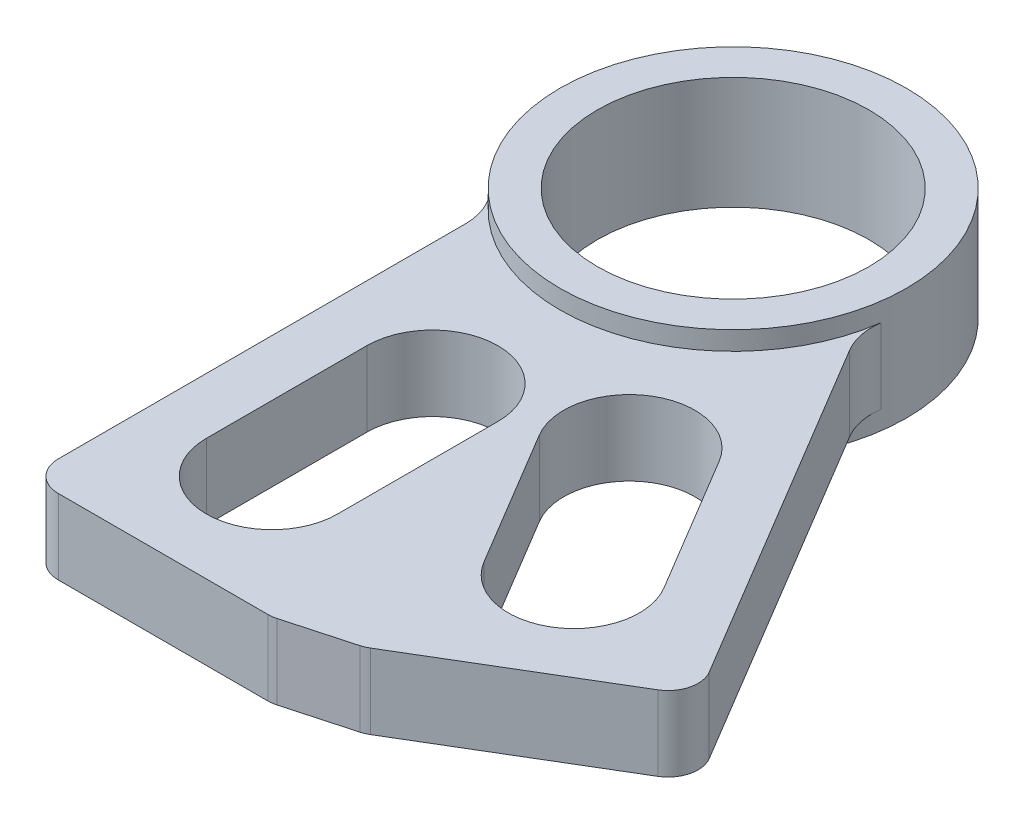
ISO-10303-21;
HEADER;
FILE_DESCRIPTION(('STEP AP214'),'2;1');
FILE_NAME('part.step','',(''),(''),'','','');
FILE_SCHEMA(('AUTOMOTIVE_DESIGN { 1 0 10303 214 1 1 1 1 }'));
ENDSEC;
DATA;
#1=APPLICATION_CONTEXT('core data for automotive mechanical design processes');
#2=APPLICATION_PROTOCOL_DEFINITION('international standard','automotive_design',2000,#1);
#3=PRODUCT_CONTEXT('',#1,'mechanical');
#4=PRODUCT('Part','Part','',(#3));
#5=PRODUCT_RELATED_PRODUCT_CATEGORY('part','',(#4));
#6=PRODUCT_DEFINITION_FORMATION('','',#4);
#7=PRODUCT_DEFINITION_CONTEXT('part definition',#1,'design');
#8=PRODUCT_DEFINITION('design','',#6,#7);
#9=PRODUCT_DEFINITION_SHAPE('','',#8);
#10=(LENGTH_UNIT() NAMED_UNIT(*) SI_UNIT(.MILLI.,.METRE.));
#11=(NAMED_UNIT(*) PLANE_ANGLE_UNIT() SI_UNIT($,.RADIAN.));
#12=(NAMED_UNIT(*) SI_UNIT($,.STERADIAN.) SOLID_ANGLE_UNIT());
#13=UNCERTAINTY_MEASURE_WITH_UNIT(LENGTH_MEASURE(1.E-05),#10,'distance_accuracy_value','');
#14=(GEOMETRIC_REPRESENTATION_CONTEXT(3) GLOBAL_UNCERTAINTY_ASSIGNED_CONTEXT((#13)) GLOBAL_UNIT_ASSIGNED_CONTEXT((#10,
#11,#12)) REPRESENTATION_CONTEXT('',''));
#15=CARTESIAN_POINT('',(0.,0.,0.));
#16=DIRECTION('',(0.,0.,1.));
#17=DIRECTION('',(1.,0.,0.));
#18=AXIS2_PLACEMENT_3D('',#15,#16,#17);
#19=CARTESIAN_POINT('',(0.,4.7625,0.));
#20=DIRECTION('',(0.,-1.,0.));
#21=DIRECTION('',(0.,0.,-1.));
#22=AXIS2_PLACEMENT_3D('',#19,#20,#21);
#23=CYLINDRICAL_SURFACE('',#22,11.5062);
#24=CARTESIAN_POINT('',(0.,4.7625,0.));
#25=DIRECTION('',(0.,1.,0.));
#26=DIRECTION('',(0.,0.,1.));
#27=AXIS2_PLACEMENT_3D('',#24,#25,#26);
#28=CIRCLE('',#27,11.5062);
#29=CARTESIAN_POINT('',(0.,4.7625,-11.5062));
#30=VERTEX_POINT('',#29);
#31=EDGE_CURVE('E285',#30,#30,#28,.T.);
#32=CARTESIAN_POINT('',(0.,-4.7625,0.));
#33=DIRECTION('',(0.,1.,0.));
#34=DIRECTION('',(0.,0.,1.));
#35=AXIS2_PLACEMENT_3D('',#32,#33,#34);
#36=CIRCLE('',#35,11.5062);
#37=CARTESIAN_POINT('',(0.,-4.7625,-11.5062));
#38=VERTEX_POINT('',#37);
#39=EDGE_CURVE('E280',#38,#38,#36,.T.);
#40=CARTESIAN_POINT('',(0.,4.7625,-11.5062));
#41=CARTESIAN_POINT('',(0.,4.66328125,-11.5062));
#42=CARTESIAN_POINT('',(0.,4.5640625,-11.5062));
#43=CARTESIAN_POINT('',(0.,4.365625,-11.5062));
#44=CARTESIAN_POINT('',(0.,4.26640625,-11.5062));
#45=CARTESIAN_POINT('',(0.,4.06796875,-11.5062));
#46=CARTESIAN_POINT('',(0.,3.96875,-11.5062));
#47=CARTESIAN_POINT('',(0.,3.7703125,-11.5062));
#48=CARTESIAN_POINT('',(0.,3.67109375,-11.5062));
#49=CARTESIAN_POINT('',(0.,3.47265625,-11.5062));
#50=CARTESIAN_POINT('',(0.,3.3734375,-11.5062));
#51=CARTESIAN_POINT('',(0.,3.175,-11.5062));
#52=CARTESIAN_POINT('',(0.,3.07578125,-11.5062));
#53=CARTESIAN_POINT('',(0.,2.87734375,-11.5062));
#54=CARTESIAN_POINT('',(0.,2.778125,-11.5062));
#55=CARTESIAN_POINT('',(0.,2.5796875,-11.5062));
#56=CARTESIAN_POINT('',(0.,2.48046875,-11.5062));
#57=CARTESIAN_POINT('',(0.,2.28203125,-11.5062));
#58=CARTESIAN_POINT('',(0.,2.1828125,-11.5062));
#59=CARTESIAN_POINT('',(0.,1.984375,-11.5062));
#60=CARTESIAN_POINT('',(0.,1.88515625,-11.5062));
#61=CARTESIAN_POINT('',(0.,1.68671875,-11.5062));
#62=CARTESIAN_POINT('',(0.,1.5875,-11.5062));
#63=CARTESIAN_POINT('',(0.,1.3890625,-11.5062));
#64=CARTESIAN_POINT('',(0.,1.28984375,-11.5062));
#65=CARTESIAN_POINT('',(0.,1.09140625,-11.5062));
#66=CARTESIAN_POINT('',(0.,0.992187499999999,-11.5062));
#67=CARTESIAN_POINT('',(0.,0.79375,-11.5062));
#68=CARTESIAN_POINT('',(0.,0.69453125,-11.5062));
#69=CARTESIAN_POINT('',(0.,0.49609375,-11.5062));
#70=CARTESIAN_POINT('',(0.,0.396875,-11.5062));
#71=CARTESIAN_POINT('',(0.,0.1984375,-11.5062));
#72=CARTESIAN_POINT('',(0.,0.0992187500000001,-11.5062));
#73=CARTESIAN_POINT('',(0.,-0.0992187500000001,-11.5062));
#74=CARTESIAN_POINT('',(0.,-0.1984375,-11.5062));
#75=CARTESIAN_POINT('',(0.,-0.396875,-11.5062));
#76=CARTESIAN_POINT('',(0.,-0.49609375,-11.5062));
#77=CARTESIAN_POINT('',(0.,-0.69453125,-11.5062));
#78=CARTESIAN_POINT('',(0.,-0.793750000000001,-11.5062));
#79=CARTESIAN_POINT('',(0.,-0.992187500000001,-11.5062));
#80=CARTESIAN_POINT('',(0.,-1.09140625,-11.5062));
#81=CARTESIAN_POINT('',(0.,-1.28984375,-11.5062));
#82=CARTESIAN_POINT('',(0.,-1.3890625,-11.5062));
#83=CARTESIAN_POINT('',(0.,-1.5875,-11.5062));
#84=CARTESIAN_POINT('',(0.,-1.68671875,-11.5062));
#85=CARTESIAN_POINT('',(0.,-1.88515625,-11.5062));
#86=CARTESIAN_POINT('',(0.,-1.984375,-11.5062));
#87=CARTESIAN_POINT('',(0.,-2.1828125,-11.5062));
#88=CARTESIAN_POINT('',(0.,-2.28203125,-11.5062));
#89=CARTESIAN_POINT('',(0.,-2.48046875,-11.5062));
#90=CARTESIAN_POINT('',(0.,-2.5796875,-11.5062));
#91=CARTESIAN_POINT('',(0.,-2.778125,-11.5062));
#92=CARTESIAN_POINT('',(0.,-2.87734375,-11.5062));
#93=CARTESIAN_POINT('',(0.,-3.07578125,-11.5062));
#94=CARTESIAN_POINT('',(0.,-3.175,-11.5062));
#95=CARTESIAN_POINT('',(0.,-3.3734375,-11.5062));
#96=CARTESIAN_POINT('',(0.,-3.47265625,-11.5062));
#97=CARTESIAN_POINT('',(0.,-3.67109375,-11.5062));
#98=CARTESIAN_POINT('',(0.,-3.7703125,-11.5062));
#99=CARTESIAN_POINT('',(0.,-3.96875,-11.5062));
#100=CARTESIAN_POINT('',(0.,-4.06796875,-11.5062));
#101=CARTESIAN_POINT('',(0.,-4.26640625,-11.5062));
#102=CARTESIAN_POINT('',(0.,-4.365625,-11.5062));
#103=CARTESIAN_POINT('',(0.,-4.5640625,-11.5062));
#104=CARTESIAN_POINT('',(0.,-4.66328125,-11.5062));
#105=CARTESIAN_POINT('',(0.,-4.7625,-11.5062));
#106=B_SPLINE_CURVE_WITH_KNOTS('',3,(#40,#41,#42,#43,#44,#45,#46,#47,#48,#49,#50,#51,#52,#53,
#54,#55,#56,#57,#58,#59,#60,#61,#62,#63,#64,#65,#66,#67,#68,#69,#70,#71,#72,#73,#74,#75,#76,#77,
#78,#79,#80,#81,#82,#83,#84,#85,#86,#87,#88,#89,#90,#91,#92,#93,#94,#95,#96,#97,#98,#99,#100,
#101,#102,#103,#104,#105),.UNSPECIFIED.,.F.,.F.,(4,2,2,2,2,2,2,2,2,2,2,2,2,2,2,2,2,2,2,2,2,2,2,
2,2,2,2,2,2,2,2,2,4),(0.,0.29765625,0.5953125,0.892968750000001,1.190625,1.48828125,1.7859375,
2.08359375,2.38125,2.67890625,2.9765625,3.27421875,3.571875,3.86953125,4.1671875,4.46484375,
4.7625,5.06015625,5.3578125,5.65546875,5.953125,6.25078125,6.5484375,6.84609375,7.14375,
7.44140625,7.7390625,8.03671875,8.334375,8.63203125,8.9296875,9.22734375,9.525),.UNSPECIFIED.);
#107=EDGE_CURVE('BSEAM43',#30,#38,#106,.T.);
#108=ORIENTED_EDGE('',*,*,#31,.T.);
#109=ORIENTED_EDGE('',*,*,#39,.F.);
#110=ORIENTED_EDGE('',*,*,#107,.T.);
#111=ORIENTED_EDGE('',*,*,#107,.F.);
#112=EDGE_LOOP('',(#108,#110,#109,#111));
#113=FACE_BOUND('',#112,.T.);
#114=ADVANCED_FACE('F43',(#113),#23,.F.);
#115=CARTESIAN_POINT('',(0.,4.7625,0.));
#116=DIRECTION('',(0.,-1.,0.));
#117=DIRECTION('',(0.,0.,-1.));
#118=AXIS2_PLACEMENT_3D('',#115,#116,#117);
#119=CYLINDRICAL_SURFACE('',#118,14.6812);
#120=DIRECTION('',(0.,-1.,0.));
#121=VECTOR('',#120,1.);
#122=CARTESIAN_POINT('',(14.5403700023967,4.7625,2.02861372207778));
#123=LINE('',#122,#121);
#124=CARTESIAN_POINT('',(14.5403700023967,3.175,2.02861372207778));
#125=VERTEX_POINT('',#124);
#126=CARTESIAN_POINT('',(14.5403700023967,-3.175,2.02861372207778));
#127=VERTEX_POINT('',#126);
#128=EDGE_CURVE('E299',#125,#127,#123,.T.);
#129=ORIENTED_EDGE('',*,*,#128,.T.);
#130=CARTESIAN_POINT('',(0.,-3.175,0.));
#131=DIRECTION('',(0.,1.,0.));
#132=DIRECTION('',(0.,0.,1.));
#133=AXIS2_PLACEMENT_3D('',#130,#131,#132);
#134=CIRCLE('',#133,14.6812);
#135=CARTESIAN_POINT('',(-11.4402024421594,-3.175,9.20105437014751));
#136=VERTEX_POINT('',#135);
#137=EDGE_CURVE('E260',#136,#127,#134,.T.);
#138=ORIENTED_EDGE('',*,*,#137,.F.);
#139=DIRECTION('',(0.,-1.,0.));
#140=VECTOR('',#139,1.);
#141=CARTESIAN_POINT('',(-11.4402024421594,4.7625,9.20105437014751));
#142=LINE('',#141,#140);
#143=CARTESIAN_POINT('',(-11.4402024421594,3.175,9.20105437014751));
#144=VERTEX_POINT('',#143);
#145=EDGE_CURVE('E292',#136,#144,#142,.F.);
#146=ORIENTED_EDGE('',*,*,#145,.T.);
#147=CARTESIAN_POINT('',(0.,3.175,0.));
#148=DIRECTION('',(0.,1.,0.));
#149=DIRECTION('',(0.,0.,1.));
#150=AXIS2_PLACEMENT_3D('',#147,#148,#149);
#151=CIRCLE('',#150,14.6812);
#152=EDGE_CURVE('E224',#144,#125,#151,.T.);
#153=ORIENTED_EDGE('',*,*,#152,.T.);
#154=EDGE_LOOP('',(#129,#138,#146,#153));
#155=FACE_BOUND('',#154,.T.);
#156=CARTESIAN_POINT('',(0.,4.7625,0.));
#157=DIRECTION('',(0.,1.,0.));
#158=DIRECTION('',(0.,0.,1.));
#159=AXIS2_PLACEMENT_3D('',#156,#157,#158);
#160=CIRCLE('',#159,14.6812);
#161=CARTESIAN_POINT('',(0.,4.7625,14.6812));
#162=VERTEX_POINT('',#161);
#163=EDGE_CURVE('E288',#162,#162,#160,.T.);
#164=ORIENTED_EDGE('',*,*,#163,.F.);
#165=EDGE_LOOP('',(#164));
#166=FACE_BOUND('',#165,.T.);
#167=CARTESIAN_POINT('',(0.,-4.7625,0.));
#168=DIRECTION('',(0.,1.,0.));
#169=DIRECTION('',(0.,0.,1.));
#170=AXIS2_PLACEMENT_3D('',#167,#168,#169);
#171=CIRCLE('',#170,14.6812);
#172=CARTESIAN_POINT('',(0.,-4.7625,14.6812));
#173=VERTEX_POINT('',#172);
#174=EDGE_CURVE('E289',#173,#173,#171,.T.);
#175=ORIENTED_EDGE('',*,*,#174,.T.);
#176=EDGE_LOOP('',(#175));
#177=FACE_BOUND('',#176,.T.);
#178=ADVANCED_FACE('F377',(#155,#166,#177),#119,.T.);
#179=CARTESIAN_POINT('',(0.,4.7625,0.));
#180=DIRECTION('',(0.,1.,0.));
#181=DIRECTION('',(0.,0.,1.));
#182=AXIS2_PLACEMENT_3D('',#179,#180,#181);
#183=PLANE('',#182);
#184=ORIENTED_EDGE('',*,*,#31,.F.);
#185=EDGE_LOOP('',(#184));
#186=FACE_BOUND('',#185,.T.);
#187=ORIENTED_EDGE('',*,*,#163,.T.);
#188=EDGE_LOOP('',(#187));
#189=FACE_BOUND('',#188,.T.);
#190=ADVANCED_FACE('F411',(#186,#189),#183,.T.);
#191=CARTESIAN_POINT('',(0.,-4.7625,0.));
#192=DIRECTION('',(0.,1.,0.));
#193=DIRECTION('',(0.,0.,1.));
#194=AXIS2_PLACEMENT_3D('',#191,#192,#193);
#195=PLANE('',#194);
#196=ORIENTED_EDGE('',*,*,#39,.T.);
#197=EDGE_LOOP('',(#196));
#198=FACE_BOUND('',#197,.T.);
#199=ORIENTED_EDGE('',*,*,#174,.F.);
#200=EDGE_LOOP('',(#199));
#201=FACE_BOUND('',#200,.T.);
#202=ADVANCED_FACE('F573',(#198,#201),#195,.F.);
#203=CARTESIAN_POINT('',(-10.31875,3.175,0.));
#204=DIRECTION('',(-1.,0.,0.));
#205=DIRECTION('',(0.,0.,1.));
#206=AXIS2_PLACEMENT_3D('',#203,#204,#205);
#207=PLANE('',#206);
#208=DIRECTION('',(0.,0.,-1.));
#209=VECTOR('',#208,1.);
#210=CARTESIAN_POINT('',(-10.31875,-3.175,0.));
#211=LINE('',#210,#209);
#212=CARTESIAN_POINT('',(-10.31875,-3.175,46.8503));
#213=VERTEX_POINT('',#212);
#214=CARTESIAN_POINT('',(-10.31875,-3.175,12.3848102075688));
#215=VERTEX_POINT('',#214);
#216=EDGE_CURVE('E262',#213,#215,#211,.T.);
#217=ORIENTED_EDGE('',*,*,#216,.F.);
#218=DIRECTION('',(0.,-1.,0.));
#219=VECTOR('',#218,1.);
#220=CARTESIAN_POINT('',(-10.31875,3.175,46.8503));
#221=LINE('',#220,#219);
#222=CARTESIAN_POINT('',(-10.31875,3.175,46.8503));
#223=VERTEX_POINT('',#222);
#224=EDGE_CURVE('E333',#213,#223,#221,.F.);
#225=ORIENTED_EDGE('',*,*,#224,.T.);
#226=DIRECTION('',(0.,0.,-1.));
#227=VECTOR('',#226,1.);
#228=CARTESIAN_POINT('',(-10.31875,3.175,0.));
#229=LINE('',#228,#227);
#230=CARTESIAN_POINT('',(-10.31875,3.175,12.3848102075688));
#231=VERTEX_POINT('',#230);
#232=EDGE_CURVE('E226',#223,#231,#229,.T.);
#233=ORIENTED_EDGE('',*,*,#232,.T.);
#234=DIRECTION('',(0.,-1.,0.));
#235=VECTOR('',#234,1.);
#236=CARTESIAN_POINT('',(-10.31875,3.175,12.3848102075688));
#237=LINE('',#236,#235);
#238=EDGE_CURVE('E305',#231,#215,#237,.T.);
#239=ORIENTED_EDGE('',*,*,#238,.T.);
#240=EDGE_LOOP('',(#217,#225,#233,#239));
#241=FACE_BOUND('',#240,.T.);
#242=ADVANCED_FACE('F565',(#241),#207,.T.);
#243=CARTESIAN_POINT('',(0.,3.175,49.3903));
#244=DIRECTION('',(0.,0.,-1.));
#245=DIRECTION('',(-1.,0.,0.));
#246=AXIS2_PLACEMENT_3D('',#243,#244,#245);
#247=PLANE('',#246);
#248=DIRECTION('',(1.,0.,0.));
#249=VECTOR('',#248,1.);
#250=CARTESIAN_POINT('',(0.,3.175,49.3903));
#251=LINE('',#250,#249);
#252=CARTESIAN_POINT('',(-7.77874999999999,3.175,49.3903));
#253=VERTEX_POINT('',#252);
#254=CARTESIAN_POINT('',(9.9745791654011,3.175,49.3903));
#255=VERTEX_POINT('',#254);
#256=EDGE_CURVE('E228',#253,#255,#251,.T.);
#257=ORIENTED_EDGE('',*,*,#256,.F.);
#258=DIRECTION('',(0.,-1.,0.));
#259=VECTOR('',#258,1.);
#260=CARTESIAN_POINT('',(-7.77874999999999,-3.175,49.3903));
#261=LINE('',#260,#259);
#262=CARTESIAN_POINT('',(-7.77874999999999,-3.175,49.3903));
#263=VERTEX_POINT('',#262);
#264=EDGE_CURVE('E322',#253,#263,#261,.T.);
#265=ORIENTED_EDGE('',*,*,#264,.T.);
#266=DIRECTION('',(1.,0.,0.));
#267=VECTOR('',#266,1.);
#268=CARTESIAN_POINT('',(0.,-3.175,49.3903));
#269=LINE('',#268,#267);
#270=CARTESIAN_POINT('',(9.9745791654011,-3.175,49.3903));
#271=VERTEX_POINT('',#270);
#272=EDGE_CURVE('E264',#263,#271,#269,.T.);
#273=ORIENTED_EDGE('',*,*,#272,.T.);
#274=DIRECTION('',(0.,-1.,0.));
#275=VECTOR('',#274,1.);
#276=CARTESIAN_POINT('',(9.9745791654011,3.175,49.3903));
#277=LINE('',#276,#275);
#278=EDGE_CURVE('E320',#271,#255,#277,.F.);
#279=ORIENTED_EDGE('',*,*,#278,.T.);
#280=EDGE_LOOP('',(#257,#265,#273,#279));
#281=FACE_BOUND('',#280,.T.);
#282=ADVANCED_FACE('F393',(#281),#247,.F.);
#283=CARTESIAN_POINT('',(13.4002921367807,3.175,48.539580558473));
#284=DIRECTION('',(-0.266114701028517,0.,-0.963941370570069));
#285=DIRECTION('',(-0.963941370570069,0.,0.266114701028517));
#286=AXIS2_PLACEMENT_3D('',#283,#284,#285);
#287=PLANE('',#286);
#288=DIRECTION('',(0.963941370570069,0.,-0.266114701028517));
#289=VECTOR('',#288,1.);
#290=CARTESIAN_POINT('',(13.4002921367807,-3.175,48.539580558473));
#291=LINE('',#290,#289);
#292=CARTESIAN_POINT('',(10.6505105060135,-3.175,49.298711081248));
#293=VERTEX_POINT('',#292);
#294=CARTESIAN_POINT('',(16.1500737675478,-3.175,47.780450035698));
#295=VERTEX_POINT('',#294);
#296=EDGE_CURVE('E267',#293,#295,#291,.T.);
#297=ORIENTED_EDGE('',*,*,#296,.T.);
#298=DIRECTION('',(0.,-1.,0.));
#299=VECTOR('',#298,1.);
#300=CARTESIAN_POINT('',(16.1500737675478,3.175,47.780450035698));
#301=LINE('',#300,#299);
#302=CARTESIAN_POINT('',(16.1500737675478,3.175,47.780450035698));
#303=VERTEX_POINT('',#302);
#304=EDGE_CURVE('E51',#295,#303,#301,.F.);
#305=ORIENTED_EDGE('',*,*,#304,.T.);
#306=DIRECTION('',(0.963941370570069,0.,-0.266114701028517));
#307=VECTOR('',#306,1.);
#308=CARTESIAN_POINT('',(13.4002921367807,3.175,48.539580558473));
#309=LINE('',#308,#307);
#310=CARTESIAN_POINT('',(10.6505105060135,3.175,49.298711081248));
#311=VERTEX_POINT('',#310);
#312=EDGE_CURVE('E231',#311,#303,#309,.T.);
#313=ORIENTED_EDGE('',*,*,#312,.F.);
#314=DIRECTION('',(0.,-1.,0.));
#315=VECTOR('',#314,1.);
#316=CARTESIAN_POINT('',(10.6505105060135,3.175,49.298711081248));
#317=LINE('',#316,#315);
#318=EDGE_CURVE('E346',#311,#293,#317,.T.);
#319=ORIENTED_EDGE('',*,*,#318,.T.);
#320=EDGE_LOOP('',(#297,#305,#313,#319));
#321=FACE_BOUND('',#320,.T.);
#322=ADVANCED_FACE('F351',(#321),#287,.F.);
#323=CARTESIAN_POINT('',(25.3390977322504,3.175,42.3949508810361));
#324=DIRECTION('',(-0.513037939276546,0.,-0.858365931793006));
#325=DIRECTION('',(-0.858365931793006,0.,0.513037939276546));
#326=AXIS2_PLACEMENT_3D('',#323,#324,#325);
#327=PLANE('',#326);
#328=DIRECTION('',(0.858365931793006,0.,-0.513037939276546));
#329=VECTOR('',#328,1.);
#330=CARTESIAN_POINT('',(25.3390977322504,3.175,42.3949508810361));
#331=LINE('',#330,#329);
#332=CARTESIAN_POINT('',(16.7772587926978,3.175,47.5122884212042));
#333=VERTEX_POINT('',#332);
#334=CARTESIAN_POINT('',(32.0161117241852,3.175,38.4041570108887));
#335=VERTEX_POINT('',#334);
#336=EDGE_CURVE('E234',#333,#335,#331,.T.);
#337=ORIENTED_EDGE('',*,*,#336,.F.);
#338=DIRECTION('',(0.,-1.,0.));
#339=VECTOR('',#338,1.);
#340=CARTESIAN_POINT('',(16.7772587926978,3.175,47.5122884212042));
#341=LINE('',#340,#339);
#342=CARTESIAN_POINT('',(16.7772587926978,-3.175,47.5122884212042));
#343=VERTEX_POINT('',#342);
#344=EDGE_CURVE('E343',#333,#343,#341,.T.);
#345=ORIENTED_EDGE('',*,*,#344,.T.);
#346=DIRECTION('',(0.858365931793006,0.,-0.513037939276546));
#347=VECTOR('',#346,1.);
#348=CARTESIAN_POINT('',(25.3390977322504,-3.175,42.3949508810361));
#349=LINE('',#348,#347);
#350=CARTESIAN_POINT('',(32.0161117241852,-3.175,38.4041570108887));
#351=VERTEX_POINT('',#350);
#352=EDGE_CURVE('E270',#343,#351,#349,.T.);
#353=ORIENTED_EDGE('',*,*,#352,.T.);
#354=DIRECTION('',(0.,-1.,0.));
#355=VECTOR('',#354,1.);
#356=CARTESIAN_POINT('',(32.0161117241852,3.175,38.4041570108887));
#357=LINE('',#356,#355);
#358=EDGE_CURVE('E66',#351,#335,#357,.F.);
#359=ORIENTED_EDGE('',*,*,#358,.T.);
#360=EDGE_LOOP('',(#337,#345,#353,#359));
#361=FACE_BOUND('',#360,.T.);
#362=ADVANCED_FACE('F361',(#361),#327,.F.);
#363=CARTESIAN_POINT('',(0.,3.175,25.48255));
#364=DIRECTION('',(0.,-1.,0.));
#365=DIRECTION('',(0.,0.,-1.));
#366=AXIS2_PLACEMENT_3D('',#363,#364,#365);
#367=CYLINDRICAL_SURFACE('',#366,5.55625);
#368=CARTESIAN_POINT('',(0.,-3.175,25.48255));
#369=DIRECTION('',(0.,1.,0.));
#370=DIRECTION('',(0.,0.,1.));
#371=AXIS2_PLACEMENT_3D('',#368,#369,#370);
#372=CIRCLE('',#371,5.55625);
#373=CARTESIAN_POINT('',(5.55625,-3.175,25.48255));
#374=VERTEX_POINT('',#373);
#375=CARTESIAN_POINT('',(-5.55624999999999,-3.175,25.48255));
#376=VERTEX_POINT('',#375);
#377=EDGE_CURVE('E248',#374,#376,#372,.T.);
#378=ORIENTED_EDGE('',*,*,#377,.F.);
#379=DIRECTION('',(0.,-1.,0.));
#380=VECTOR('',#379,1.);
#381=CARTESIAN_POINT('',(5.55625,3.175,25.48255));
#382=LINE('',#381,#380);
#383=CARTESIAN_POINT('',(5.55625,3.175,25.48255));
#384=VERTEX_POINT('',#383);
#385=EDGE_CURVE('E278',#384,#374,#382,.T.);
#386=ORIENTED_EDGE('',*,*,#385,.F.);
#387=CARTESIAN_POINT('',(0.,3.175,25.48255));
#388=DIRECTION('',(0.,1.,0.));
#389=DIRECTION('',(0.,0.,1.));
#390=AXIS2_PLACEMENT_3D('',#387,#388,#389);
#391=CIRCLE('',#390,5.55625);
#392=CARTESIAN_POINT('',(-5.55624999999999,3.175,25.48255));
#393=VERTEX_POINT('',#392);
#394=EDGE_CURVE('E213',#384,#393,#391,.T.);
#395=ORIENTED_EDGE('',*,*,#394,.T.);
#396=DIRECTION('',(0.,-1.,0.));
#397=VECTOR('',#396,1.);
#398=CARTESIAN_POINT('',(-5.55624999999999,3.175,25.48255));
#399=LINE('',#398,#397);
#400=EDGE_CURVE('E192',#393,#376,#399,.T.);
#401=ORIENTED_EDGE('',*,*,#400,.T.);
#402=EDGE_LOOP('',(#378,#386,#395,#401));
#403=FACE_BOUND('',#402,.T.);
#404=ADVANCED_FACE('F534',(#403),#367,.F.);
#405=CARTESIAN_POINT('',(5.55625,3.175,0.));
#406=DIRECTION('',(-1.,0.,0.));
#407=DIRECTION('',(0.,0.,1.));
#408=AXIS2_PLACEMENT_3D('',#405,#406,#407);
#409=PLANE('',#408);
#410=DIRECTION('',(0.,0.,-1.));
#411=VECTOR('',#410,1.);
#412=CARTESIAN_POINT('',(5.55625,-3.175,0.));
#413=LINE('',#412,#411);
#414=CARTESIAN_POINT('',(5.55625,-3.175,39.07155));
#415=VERTEX_POINT('',#414);
#416=EDGE_CURVE('E251',#415,#374,#413,.T.);
#417=ORIENTED_EDGE('',*,*,#416,.F.);
#418=DIRECTION('',(0.,-1.,0.));
#419=VECTOR('',#418,1.);
#420=CARTESIAN_POINT('',(5.55625,3.175,39.07155));
#421=LINE('',#420,#419);
#422=CARTESIAN_POINT('',(5.55625,3.175,39.07155));
#423=VERTEX_POINT('',#422);
#424=EDGE_CURVE('E276',#423,#415,#421,.T.);
#425=ORIENTED_EDGE('',*,*,#424,.F.);
#426=DIRECTION('',(0.,0.,-1.));
#427=VECTOR('',#426,1.);
#428=CARTESIAN_POINT('',(5.55625,3.175,0.));
#429=LINE('',#428,#427);
#430=EDGE_CURVE('E216',#423,#384,#429,.T.);
#431=ORIENTED_EDGE('',*,*,#430,.T.);
#432=ORIENTED_EDGE('',*,*,#385,.T.);
#433=EDGE_LOOP('',(#417,#425,#431,#432));
#434=FACE_BOUND('',#433,.T.);
#435=ADVANCED_FACE('F525',(#434),#409,.T.);
#436=CARTESIAN_POINT('',(0.,3.175,39.07155));
#437=DIRECTION('',(0.,-1.,0.));
#438=DIRECTION('',(0.,0.,-1.));
#439=AXIS2_PLACEMENT_3D('',#436,#437,#438);
#440=CYLINDRICAL_SURFACE('',#439,5.55625);
#441=CARTESIAN_POINT('',(0.,-3.175,39.07155));
#442=DIRECTION('',(0.,1.,0.));
#443=DIRECTION('',(0.,0.,1.));
#444=AXIS2_PLACEMENT_3D('',#441,#442,#443);
#445=CIRCLE('',#444,5.55625);
#446=CARTESIAN_POINT('',(-5.55625,-3.175,39.07155));
#447=VERTEX_POINT('',#446);
#448=EDGE_CURVE('E254',#447,#415,#445,.T.);
#449=ORIENTED_EDGE('',*,*,#448,.F.);
#450=DIRECTION('',(0.,-1.,0.));
#451=VECTOR('',#450,1.);
#452=CARTESIAN_POINT('',(-5.55625,3.175,39.07155));
#453=LINE('',#452,#451);
#454=CARTESIAN_POINT('',(-5.55625,3.175,39.07155));
#455=VERTEX_POINT('',#454);
#456=EDGE_CURVE('E274',#455,#447,#453,.T.);
#457=ORIENTED_EDGE('',*,*,#456,.F.);
#458=CARTESIAN_POINT('',(0.,3.175,39.07155));
#459=DIRECTION('',(0.,1.,0.));
#460=DIRECTION('',(0.,0.,1.));
#461=AXIS2_PLACEMENT_3D('',#458,#459,#460);
#462=CIRCLE('',#461,5.55625);
#463=EDGE_CURVE('E219',#455,#423,#462,.T.);
#464=ORIENTED_EDGE('',*,*,#463,.T.);
#465=ORIENTED_EDGE('',*,*,#424,.T.);
#466=EDGE_LOOP('',(#449,#457,#464,#465));
#467=FACE_BOUND('',#466,.T.);
#468=ADVANCED_FACE('F517',(#467),#440,.F.);
#469=CARTESIAN_POINT('',(13.0735149395116,3.175,21.8733527752118));
#470=DIRECTION('',(0.,-1.,0.));
#471=DIRECTION('',(0.,0.,-1.));
#472=AXIS2_PLACEMENT_3D('',#469,#470,#471);
#473=CYLINDRICAL_SURFACE('',#472,5.55624999999999);
#474=CARTESIAN_POINT('',(13.0735149395116,-3.175,21.8733527752118));
#475=DIRECTION('',(0.,1.,0.));
#476=DIRECTION('',(0.,0.,1.));
#477=AXIS2_PLACEMENT_3D('',#474,#475,#476);
#478=CIRCLE('',#477,5.55624999999999);
#479=CARTESIAN_POINT('',(17.8428106480365,-3.175,19.0227857251065));
#480=VERTEX_POINT('',#479);
#481=CARTESIAN_POINT('',(8.30421923098669,-3.175,24.7239198253171));
#482=VERTEX_POINT('',#481);
#483=EDGE_CURVE('E187',#480,#482,#478,.T.);
#484=ORIENTED_EDGE('',*,*,#483,.F.);
#485=DIRECTION('',(0.,-1.,0.));
#486=VECTOR('',#485,1.);
#487=CARTESIAN_POINT('',(17.8428106480365,3.175,19.0227857251065));
#488=LINE('',#487,#486);
#489=CARTESIAN_POINT('',(17.8428106480365,3.175,19.0227857251065));
#490=VERTEX_POINT('',#489);
#491=EDGE_CURVE('E182',#490,#480,#488,.T.);
#492=ORIENTED_EDGE('',*,*,#491,.F.);
#493=CARTESIAN_POINT('',(13.0735149395116,3.175,21.8733527752118));
#494=DIRECTION('',(0.,1.,0.));
#495=DIRECTION('',(0.,0.,1.));
#496=AXIS2_PLACEMENT_3D('',#493,#494,#495);
#497=CIRCLE('',#496,5.55624999999999);
#498=CARTESIAN_POINT('',(8.30421923098669,3.175,24.7239198253171));
#499=VERTEX_POINT('',#498);
#500=EDGE_CURVE('E185',#490,#499,#497,.T.);
#501=ORIENTED_EDGE('',*,*,#500,.T.);
#502=DIRECTION('',(0.,-1.,0.));
#503=VECTOR('',#502,1.);
#504=CARTESIAN_POINT('',(8.30421923098669,3.175,24.7239198253171));
#505=LINE('',#504,#503);
#506=EDGE_CURVE('E238',#499,#482,#505,.T.);
#507=ORIENTED_EDGE('',*,*,#506,.T.);
#508=EDGE_LOOP('',(#484,#492,#501,#507));
#509=FACE_BOUND('',#508,.T.);
#510=ADVANCED_FACE('F184',(#509),#473,.F.);
#511=CARTESIAN_POINT('',(4.76929570852492,3.175,-2.85056705010532));
#512=DIRECTION('',(-0.858365931793006,0.,0.513037939276545));
#513=DIRECTION('',(0.513037939276545,0.,0.858365931793006));
#514=AXIS2_PLACEMENT_3D('',#511,#512,#513);
#515=PLANE('',#514);
#516=DIRECTION('',(-0.513037939276545,0.,-0.858365931793006));
#517=VECTOR('',#516,1.);
#518=CARTESIAN_POINT('',(4.76929570852492,-3.175,-2.85056705010532));
#519=LINE('',#518,#517);
#520=CARTESIAN_POINT('',(24.8144832048654,-3.175,30.6871203722417));
#521=VERTEX_POINT('',#520);
#522=EDGE_CURVE('E240',#521,#480,#519,.T.);
#523=ORIENTED_EDGE('',*,*,#522,.F.);
#524=DIRECTION('',(0.,-1.,0.));
#525=VECTOR('',#524,1.);
#526=CARTESIAN_POINT('',(24.8144832048654,3.175,30.6871203722417));
#527=LINE('',#526,#525);
#528=CARTESIAN_POINT('',(24.8144832048654,3.175,30.6871203722417));
#529=VERTEX_POINT('',#528);
#530=EDGE_CURVE('E193',#529,#521,#527,.T.);
#531=ORIENTED_EDGE('',*,*,#530,.F.);
#532=DIRECTION('',(-0.513037939276545,0.,-0.858365931793006));
#533=VECTOR('',#532,1.);
#534=CARTESIAN_POINT('',(4.76929570852492,3.175,-2.85056705010532));
#535=LINE('',#534,#533);
#536=EDGE_CURVE('E200',#529,#490,#535,.T.);
#537=ORIENTED_EDGE('',*,*,#536,.T.);
#538=ORIENTED_EDGE('',*,*,#491,.T.);
#539=EDGE_LOOP('',(#523,#531,#537,#538));
#540=FACE_BOUND('',#539,.T.);
#541=ADVANCED_FACE('F207',(#540),#515,.T.);
#542=CARTESIAN_POINT('',(20.0451874963405,3.175,33.537687422347));
#543=DIRECTION('',(0.,-1.,0.));
#544=DIRECTION('',(0.,0.,-1.));
#545=AXIS2_PLACEMENT_3D('',#542,#543,#544);
#546=CYLINDRICAL_SURFACE('',#545,5.55624999999999);
#547=CARTESIAN_POINT('',(20.0451874963405,-3.175,33.537687422347));
#548=DIRECTION('',(0.,1.,0.));
#549=DIRECTION('',(0.,0.,1.));
#550=AXIS2_PLACEMENT_3D('',#547,#548,#549);
#551=CIRCLE('',#550,5.55624999999999);
#552=CARTESIAN_POINT('',(15.2758917878157,-3.175,36.3882544724523));
#553=VERTEX_POINT('',#552);
#554=EDGE_CURVE('E242',#553,#521,#551,.T.);
#555=ORIENTED_EDGE('',*,*,#554,.F.);
#556=DIRECTION('',(0.,-1.,0.));
#557=VECTOR('',#556,1.);
#558=CARTESIAN_POINT('',(15.2758917878157,3.175,36.3882544724523));
#559=LINE('',#558,#557);
#560=CARTESIAN_POINT('',(15.2758917878157,3.175,36.3882544724523));
#561=VERTEX_POINT('',#560);
#562=EDGE_CURVE('E282',#561,#553,#559,.T.);
#563=ORIENTED_EDGE('',*,*,#562,.F.);
#564=CARTESIAN_POINT('',(20.0451874963405,3.175,33.537687422347));
#565=DIRECTION('',(0.,1.,0.));
#566=DIRECTION('',(0.,0.,1.));
#567=AXIS2_PLACEMENT_3D('',#564,#565,#566);
#568=CIRCLE('',#567,5.55624999999999);
#569=EDGE_CURVE('E208',#561,#529,#568,.T.);
#570=ORIENTED_EDGE('',*,*,#569,.T.);
#571=ORIENTED_EDGE('',*,*,#530,.T.);
#572=EDGE_LOOP('',(#555,#563,#570,#571));
#573=FACE_BOUND('',#572,.T.);
#574=ADVANCED_FACE('F493',(#573),#546,.F.);
#575=CARTESIAN_POINT('',(-5.55624999999999,3.175,0.));
#576=DIRECTION('',(-1.,0.,0.));
#577=DIRECTION('',(0.,0.,1.));
#578=AXIS2_PLACEMENT_3D('',#575,#576,#577);
#579=PLANE('',#578);
#580=DIRECTION('',(0.,0.,-1.));
#581=VECTOR('',#580,1.);
#582=CARTESIAN_POINT('',(-5.55624999999999,-3.175,0.));
#583=LINE('',#582,#581);
#584=EDGE_CURVE('E257',#447,#376,#583,.T.);
#585=ORIENTED_EDGE('',*,*,#584,.T.);
#586=ORIENTED_EDGE('',*,*,#400,.F.);
#587=DIRECTION('',(0.,0.,-1.));
#588=VECTOR('',#587,1.);
#589=CARTESIAN_POINT('',(-5.55624999999999,3.175,0.));
#590=LINE('',#589,#588);
#591=EDGE_CURVE('E222',#455,#393,#590,.T.);
#592=ORIENTED_EDGE('',*,*,#591,.F.);
#593=ORIENTED_EDGE('',*,*,#456,.T.);
#594=EDGE_LOOP('',(#585,#586,#592,#593));
#595=FACE_BOUND('',#594,.T.);
#596=ADVANCED_FACE('F484',(#595),#579,.F.);
#597=CARTESIAN_POINT('',(-4.76929570852484,3.175,2.85056705010528));
#598=DIRECTION('',(-0.858365931793006,0.,0.513037939276545));
#599=DIRECTION('',(0.513037939276545,0.,0.858365931793006));
#600=AXIS2_PLACEMENT_3D('',#597,#598,#599);
#601=PLANE('',#600);
#602=DIRECTION('',(-0.513037939276545,0.,-0.858365931793006));
#603=VECTOR('',#602,1.);
#604=CARTESIAN_POINT('',(-4.76929570852484,-3.175,2.85056705010528));
#605=LINE('',#604,#603);
#606=EDGE_CURVE('E245',#553,#482,#605,.T.);
#607=ORIENTED_EDGE('',*,*,#606,.T.);
#608=ORIENTED_EDGE('',*,*,#506,.F.);
#609=DIRECTION('',(-0.513037939276545,0.,-0.858365931793006));
#610=VECTOR('',#609,1.);
#611=CARTESIAN_POINT('',(-4.76929570852484,3.175,2.85056705010528));
#612=LINE('',#611,#610);
#613=EDGE_CURVE('E203',#561,#499,#612,.T.);
#614=ORIENTED_EDGE('',*,*,#613,.F.);
#615=ORIENTED_EDGE('',*,*,#562,.T.);
#616=EDGE_LOOP('',(#607,#608,#614,#615));
#617=FACE_BOUND('',#616,.T.);
#618=ADVANCED_FACE('F476',(#617),#601,.F.);
#619=CARTESIAN_POINT('',(8.85726345868911,3.175,-5.29391023590987));
#620=DIRECTION('',(-0.858365931793006,0.,0.513037939276546));
#621=DIRECTION('',(0.513037939276546,0.,0.858365931793006));
#622=AXIS2_PLACEMENT_3D('',#619,#620,#621);
#623=PLANE('',#622);
#624=DIRECTION('',(-0.513037939276546,0.,-0.858365931793006));
#625=VECTOR('',#624,1.);
#626=CARTESIAN_POINT('',(8.85726345868911,3.175,-5.29391023590987));
#627=LINE('',#626,#625);
#628=CARTESIAN_POINT('',(32.8932448251771,3.175,34.920791178372));
#629=VERTEX_POINT('',#628);
#630=CARTESIAN_POINT('',(15.2111409659113,3.175,5.33678891798941));
#631=VERTEX_POINT('',#630);
#632=EDGE_CURVE('E236',#629,#631,#627,.T.);
#633=ORIENTED_EDGE('',*,*,#632,.F.);
#634=DIRECTION('',(0.,-1.,0.));
#635=VECTOR('',#634,1.);
#636=CARTESIAN_POINT('',(32.8932448251771,3.175,34.920791178372));
#637=LINE('',#636,#635);
#638=CARTESIAN_POINT('',(32.8932448251771,-3.175,34.920791178372));
#639=VERTEX_POINT('',#638);
#640=EDGE_CURVE('E11',#629,#639,#637,.T.);
#641=ORIENTED_EDGE('',*,*,#640,.T.);
#642=DIRECTION('',(-0.513037939276546,0.,-0.858365931793006));
#643=VECTOR('',#642,1.);
#644=CARTESIAN_POINT('',(8.85726345868911,-3.175,-5.29391023590987));
#645=LINE('',#644,#643);
#646=CARTESIAN_POINT('',(15.2111409659113,-3.175,5.33678891798941));
#647=VERTEX_POINT('',#646);
#648=EDGE_CURVE('E205',#639,#647,#645,.T.);
#649=ORIENTED_EDGE('',*,*,#648,.T.);
#650=DIRECTION('',(0.,1.,0.));
#651=VECTOR('',#650,1.);
#652=CARTESIAN_POINT('',(15.2111409659113,3.175,5.33678891798941));
#653=LINE('',#652,#651);
#654=EDGE_CURVE('E302',#647,#631,#653,.T.);
#655=ORIENTED_EDGE('',*,*,#654,.T.);
#656=EDGE_LOOP('',(#633,#641,#649,#655));
#657=FACE_BOUND('',#656,.T.);
#658=ADVANCED_FACE('F369',(#657),#623,.F.);
#659=CARTESIAN_POINT('',(0.,3.175,0.));
#660=DIRECTION('',(0.,1.,0.));
#661=DIRECTION('',(0.,0.,1.));
#662=AXIS2_PLACEMENT_3D('',#659,#660,#661);
#663=PLANE('',#662);
#664=ORIENTED_EDGE('',*,*,#500,.F.);
#665=ORIENTED_EDGE('',*,*,#536,.F.);
#666=ORIENTED_EDGE('',*,*,#569,.F.);
#667=ORIENTED_EDGE('',*,*,#613,.T.);
#668=EDGE_LOOP('',(#664,#665,#666,#667));
#669=FACE_BOUND('',#668,.T.);
#670=ORIENTED_EDGE('',*,*,#394,.F.);
#671=ORIENTED_EDGE('',*,*,#430,.F.);
#672=ORIENTED_EDGE('',*,*,#463,.F.);
#673=ORIENTED_EDGE('',*,*,#591,.T.);
#674=EDGE_LOOP('',(#670,#671,#672,#673));
#675=FACE_BOUND('',#674,.T.);
#676=ORIENTED_EDGE('',*,*,#232,.F.);
#677=CARTESIAN_POINT('',(-7.77874999999999,3.175,46.8503));
#678=DIRECTION('',(0.,1.,0.));
#679=DIRECTION('',(0.,0.,1.));
#680=AXIS2_PLACEMENT_3D('',#677,#678,#679);
#681=CIRCLE('',#680,2.54);
#682=EDGE_CURVE('E340',#223,#253,#681,.T.);
#683=ORIENTED_EDGE('',*,*,#682,.T.);
#684=ORIENTED_EDGE('',*,*,#256,.T.);
#685=CARTESIAN_POINT('',(9.9745791654011,3.175,46.8503));
#686=DIRECTION('',(0.,1.,0.));
#687=DIRECTION('',(0.,0.,1.));
#688=AXIS2_PLACEMENT_3D('',#685,#686,#687);
#689=CIRCLE('',#688,2.54);
#690=EDGE_CURVE('E336',#255,#311,#689,.T.);
#691=ORIENTED_EDGE('',*,*,#690,.T.);
#692=ORIENTED_EDGE('',*,*,#312,.T.);
#693=CARTESIAN_POINT('',(15.4741424269354,3.175,45.33203895445));
#694=DIRECTION('',(0.,1.,0.));
#695=DIRECTION('',(0.,0.,1.));
#696=AXIS2_PLACEMENT_3D('',#693,#694,#695);
#697=CIRCLE('',#696,2.54);
#698=EDGE_CURVE('E338',#303,#333,#697,.T.);
#699=ORIENTED_EDGE('',*,*,#698,.T.);
#700=ORIENTED_EDGE('',*,*,#336,.T.);
#701=CARTESIAN_POINT('',(30.7129953584228,3.175,36.2239075441344));
#702=DIRECTION('',(0.,1.,0.));
#703=DIRECTION('',(0.,0.,1.));
#704=AXIS2_PLACEMENT_3D('',#701,#702,#703);
#705=CIRCLE('',#704,2.54);
#706=EDGE_CURVE('E58',#335,#629,#705,.T.);
#707=ORIENTED_EDGE('',*,*,#706,.T.);
#708=ORIENTED_EDGE('',*,*,#632,.T.);
#709=CARTESIAN_POINT('',(19.5716398994198,3.175,2.73055618646455));
#710=DIRECTION('',(0.,1.,0.));
#711=DIRECTION('',(0.,0.,1.));
#712=AXIS2_PLACEMENT_3D('',#709,#710,#711);
#713=CIRCLE('',#712,5.08);
#714=EDGE_CURVE('E311',#631,#125,#713,.F.);
#715=ORIENTED_EDGE('',*,*,#714,.T.);
#716=ORIENTED_EDGE('',*,*,#152,.F.);
#717=CARTESIAN_POINT('',(-15.39875,3.175,12.3848102075688));
#718=DIRECTION('',(0.,1.,0.));
#719=DIRECTION('',(0.,0.,1.));
#720=AXIS2_PLACEMENT_3D('',#717,#718,#719);
#721=CIRCLE('',#720,5.08);
#722=EDGE_CURVE('E317',#144,#231,#721,.F.);
#723=ORIENTED_EDGE('',*,*,#722,.T.);
#724=EDGE_LOOP('',(#676,#683,#684,#691,#692,#699,#700,#707,#708,#715,#716,#723));
#725=FACE_BOUND('',#724,.T.);
#726=ADVANCED_FACE('F197',(#669,#675,#725),#663,.T.);
#727=CARTESIAN_POINT('',(0.,-3.175,0.));
#728=DIRECTION('',(0.,1.,0.));
#729=DIRECTION('',(0.,0.,1.));
#730=AXIS2_PLACEMENT_3D('',#727,#728,#729);
#731=PLANE('',#730);
#732=ORIENTED_EDGE('',*,*,#483,.T.);
#733=ORIENTED_EDGE('',*,*,#606,.F.);
#734=ORIENTED_EDGE('',*,*,#554,.T.);
#735=ORIENTED_EDGE('',*,*,#522,.T.);
#736=EDGE_LOOP('',(#732,#733,#734,#735));
#737=FACE_BOUND('',#736,.T.);
#738=ORIENTED_EDGE('',*,*,#377,.T.);
#739=ORIENTED_EDGE('',*,*,#584,.F.);
#740=ORIENTED_EDGE('',*,*,#448,.T.);
#741=ORIENTED_EDGE('',*,*,#416,.T.);
#742=EDGE_LOOP('',(#738,#739,#740,#741));
#743=FACE_BOUND('',#742,.T.);
#744=ORIENTED_EDGE('',*,*,#272,.F.);
#745=CARTESIAN_POINT('',(-7.77874999999999,-3.175,46.8503));
#746=DIRECTION('',(0.,1.,0.));
#747=DIRECTION('',(0.,0.,1.));
#748=AXIS2_PLACEMENT_3D('',#745,#746,#747);
#749=CIRCLE('',#748,2.54);
#750=EDGE_CURVE('E331',#263,#213,#749,.F.);
#751=ORIENTED_EDGE('',*,*,#750,.T.);
#752=ORIENTED_EDGE('',*,*,#216,.T.);
#753=CARTESIAN_POINT('',(-15.39875,-3.175,12.3848102075688));
#754=DIRECTION('',(0.,1.,0.));
#755=DIRECTION('',(0.,0.,1.));
#756=AXIS2_PLACEMENT_3D('',#753,#754,#755);
#757=CIRCLE('',#756,5.08);
#758=EDGE_CURVE('E314',#215,#136,#757,.T.);
#759=ORIENTED_EDGE('',*,*,#758,.T.);
#760=ORIENTED_EDGE('',*,*,#137,.T.);
#761=CARTESIAN_POINT('',(19.5716398994198,-3.175,2.73055618646455));
#762=DIRECTION('',(0.,1.,0.));
#763=DIRECTION('',(0.,0.,1.));
#764=AXIS2_PLACEMENT_3D('',#761,#762,#763);
#765=CIRCLE('',#764,5.08);
#766=EDGE_CURVE('E308',#127,#647,#765,.T.);
#767=ORIENTED_EDGE('',*,*,#766,.T.);
#768=ORIENTED_EDGE('',*,*,#648,.F.);
#769=CARTESIAN_POINT('',(30.7129953584228,-3.175,36.2239075441344));
#770=DIRECTION('',(0.,1.,0.));
#771=DIRECTION('',(0.,0.,1.));
#772=AXIS2_PLACEMENT_3D('',#769,#770,#771);
#773=CIRCLE('',#772,2.54);
#774=EDGE_CURVE('E325',#639,#351,#773,.F.);
#775=ORIENTED_EDGE('',*,*,#774,.T.);
#776=ORIENTED_EDGE('',*,*,#352,.F.);
#777=CARTESIAN_POINT('',(15.4741424269354,-3.175,45.33203895445));
#778=DIRECTION('',(0.,1.,0.));
#779=DIRECTION('',(0.,0.,1.));
#780=AXIS2_PLACEMENT_3D('',#777,#778,#779);
#781=CIRCLE('',#780,2.54);
#782=EDGE_CURVE('E329',#343,#295,#781,.F.);
#783=ORIENTED_EDGE('',*,*,#782,.T.);
#784=ORIENTED_EDGE('',*,*,#296,.F.);
#785=CARTESIAN_POINT('',(9.9745791654011,-3.175,46.8503));
#786=DIRECTION('',(0.,1.,0.));
#787=DIRECTION('',(0.,0.,1.));
#788=AXIS2_PLACEMENT_3D('',#785,#786,#787);
#789=CIRCLE('',#788,2.54);
#790=EDGE_CURVE('E327',#293,#271,#789,.F.);
#791=ORIENTED_EDGE('',*,*,#790,.T.);
#792=EDGE_LOOP('',(#744,#751,#752,#759,#760,#767,#768,#775,#776,#783,#784,#791));
#793=FACE_BOUND('',#792,.T.);
#794=ADVANCED_FACE('F364',(#737,#743,#793),#731,.F.);
#795=CARTESIAN_POINT('',(19.5716398994198,4.7625,2.73055618646455));
#796=DIRECTION('',(0.,-1.,0.));
#797=DIRECTION('',(0.,0.,-1.));
#798=AXIS2_PLACEMENT_3D('',#795,#796,#797);
#799=CYLINDRICAL_SURFACE('',#798,5.08);
#800=ORIENTED_EDGE('',*,*,#714,.F.);
#801=ORIENTED_EDGE('',*,*,#654,.F.);
#802=ORIENTED_EDGE('',*,*,#766,.F.);
#803=ORIENTED_EDGE('',*,*,#128,.F.);
#804=EDGE_LOOP('',(#800,#801,#802,#803));
#805=FACE_BOUND('',#804,.T.);
#806=ADVANCED_FACE('F375',(#805),#799,.F.);
#807=CARTESIAN_POINT('',(-15.39875,4.7625,12.3848102075688));
#808=DIRECTION('',(0.,-1.,0.));
#809=DIRECTION('',(0.,0.,-1.));
#810=AXIS2_PLACEMENT_3D('',#807,#808,#809);
#811=CYLINDRICAL_SURFACE('',#810,5.08);
#812=ORIENTED_EDGE('',*,*,#722,.F.);
#813=ORIENTED_EDGE('',*,*,#145,.F.);
#814=ORIENTED_EDGE('',*,*,#758,.F.);
#815=ORIENTED_EDGE('',*,*,#238,.F.);
#816=EDGE_LOOP('',(#812,#813,#814,#815));
#817=FACE_BOUND('',#816,.T.);
#818=ADVANCED_FACE('F384',(#817),#811,.F.);
#819=CARTESIAN_POINT('',(-7.77874999999999,3.175,46.8503));
#820=DIRECTION('',(0.,1.,0.));
#821=DIRECTION('',(0.,0.,1.));
#822=AXIS2_PLACEMENT_3D('',#819,#820,#821);
#823=CYLINDRICAL_SURFACE('',#822,2.54);
#824=ORIENTED_EDGE('',*,*,#682,.F.);
#825=ORIENTED_EDGE('',*,*,#224,.F.);
#826=ORIENTED_EDGE('',*,*,#750,.F.);
#827=ORIENTED_EDGE('',*,*,#264,.F.);
#828=EDGE_LOOP('',(#824,#825,#826,#827));
#829=FACE_BOUND('',#828,.T.);
#830=ADVANCED_FACE('F391',(#829),#823,.T.);
#831=CARTESIAN_POINT('',(15.4741424269354,3.175,45.33203895445));
#832=DIRECTION('',(0.,-1.,0.));
#833=DIRECTION('',(0.,0.,-1.));
#834=AXIS2_PLACEMENT_3D('',#831,#832,#833);
#835=CYLINDRICAL_SURFACE('',#834,2.54);
#836=ORIENTED_EDGE('',*,*,#698,.F.);
#837=ORIENTED_EDGE('',*,*,#304,.F.);
#838=ORIENTED_EDGE('',*,*,#782,.F.);
#839=ORIENTED_EDGE('',*,*,#344,.F.);
#840=EDGE_LOOP('',(#836,#837,#838,#839));
#841=FACE_BOUND('',#840,.T.);
#842=ADVANCED_FACE('F359',(#841),#835,.T.);
#843=CARTESIAN_POINT('',(9.9745791654011,3.175,46.8503));
#844=DIRECTION('',(0.,-1.,0.));
#845=DIRECTION('',(0.,0.,-1.));
#846=AXIS2_PLACEMENT_3D('',#843,#844,#845);
#847=CYLINDRICAL_SURFACE('',#846,2.54);
#848=ORIENTED_EDGE('',*,*,#690,.F.);
#849=ORIENTED_EDGE('',*,*,#278,.F.);
#850=ORIENTED_EDGE('',*,*,#790,.F.);
#851=ORIENTED_EDGE('',*,*,#318,.F.);
#852=EDGE_LOOP('',(#848,#849,#850,#851));
#853=FACE_BOUND('',#852,.T.);
#854=ADVANCED_FACE('F397',(#853),#847,.T.);
#855=CARTESIAN_POINT('',(30.7129953584228,3.175,36.2239075441344));
#856=DIRECTION('',(0.,-1.,0.));
#857=DIRECTION('',(0.,0.,-1.));
#858=AXIS2_PLACEMENT_3D('',#855,#856,#857);
#859=CYLINDRICAL_SURFACE('',#858,2.54);
#860=ORIENTED_EDGE('',*,*,#706,.F.);
#861=ORIENTED_EDGE('',*,*,#358,.F.);
#862=ORIENTED_EDGE('',*,*,#774,.F.);
#863=ORIENTED_EDGE('',*,*,#640,.F.);
#864=EDGE_LOOP('',(#860,#861,#862,#863));
#865=FACE_BOUND('',#864,.T.);
#866=ADVANCED_FACE('F45',(#865),#859,.T.);
#867=CLOSED_SHELL('',(#114,#178,#190,#202,#242,#282,#322,#362,#404,#435,#468,#510,#541,#574,
#596,#618,#658,#726,#794,#806,#818,#830,#842,#854,#866));
#868=MANIFOLD_SOLID_BREP('B2',#867);
#869=ADVANCED_BREP_SHAPE_REPRESENTATION('',(#18,#868),#14);
#870=SHAPE_DEFINITION_REPRESENTATION(#9,#869);
ENDSEC;
END-ISO-10303-21;
